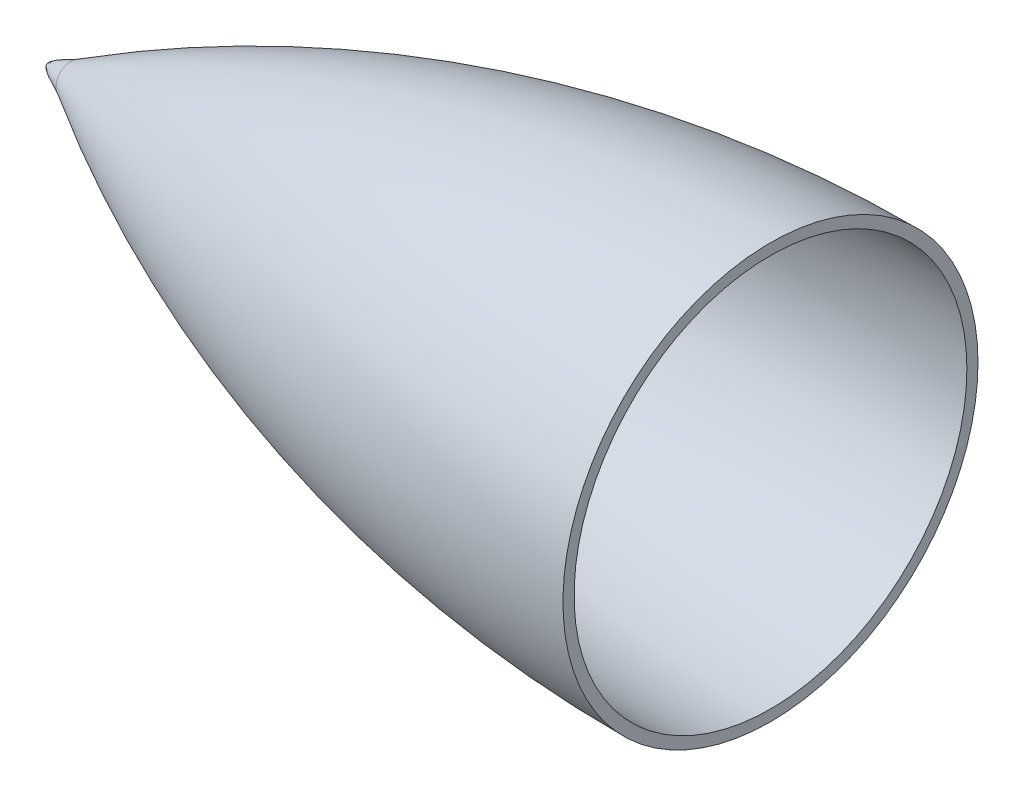
ISO-10303-21;
HEADER;
FILE_DESCRIPTION(('STEP AP214'),'2;1');
FILE_NAME('part.step','',(''),(''),'','','');
FILE_SCHEMA(('AUTOMOTIVE_DESIGN { 1 0 10303 214 1 1 1 1 }'));
ENDSEC;
DATA;
#1=APPLICATION_CONTEXT('core data for automotive mechanical design processes');
#2=APPLICATION_PROTOCOL_DEFINITION('international standard','automotive_design',2000,#1);
#3=PRODUCT_CONTEXT('',#1,'mechanical');
#4=PRODUCT('Part','Part','',(#3));
#5=PRODUCT_RELATED_PRODUCT_CATEGORY('part','',(#4));
#6=PRODUCT_DEFINITION_FORMATION('','',#4);
#7=PRODUCT_DEFINITION_CONTEXT('part definition',#1,'design');
#8=PRODUCT_DEFINITION('design','',#6,#7);
#9=PRODUCT_DEFINITION_SHAPE('','',#8);
#10=(LENGTH_UNIT() NAMED_UNIT(*) SI_UNIT(.MILLI.,.METRE.));
#11=(NAMED_UNIT(*) PLANE_ANGLE_UNIT() SI_UNIT($,.RADIAN.));
#12=(NAMED_UNIT(*) SI_UNIT($,.STERADIAN.) SOLID_ANGLE_UNIT());
#13=UNCERTAINTY_MEASURE_WITH_UNIT(LENGTH_MEASURE(1.E-05),#10,'distance_accuracy_value','');
#14=(GEOMETRIC_REPRESENTATION_CONTEXT(3) GLOBAL_UNCERTAINTY_ASSIGNED_CONTEXT((#13)) GLOBAL_UNIT_ASSIGNED_CONTEXT((#10,
#11,#12)) REPRESENTATION_CONTEXT('',''));
#15=CARTESIAN_POINT('',(0.,0.,0.));
#16=DIRECTION('',(0.,0.,1.));
#17=DIRECTION('',(1.,0.,0.));
#18=AXIS2_PLACEMENT_3D('',#15,#16,#17);
#19=CARTESIAN_POINT('',(0.,240.127906976744,0.));
#20=DIRECTION('',(1.,0.,0.));
#21=DIRECTION('',(0.,0.,-1.));
#22=AXIS2_PLACEMENT_3D('',#19,#20,#21);
#23=DEGENERATE_TOROIDAL_SURFACE('',#22,240.127906976744,283.127906976744,.F.);
#24=CARTESIAN_POINT('',(0.,240.127906976744,0.));
#25=DIRECTION('',(1.,0.,0.));
#26=DIRECTION('',(0.,0.,-1.));
#27=AXIS2_PLACEMENT_3D('',#24,#25,#26);
#28=CIRCLE('',#27,43.);
#29=CARTESIAN_POINT('',(0.,240.127906976744,-43.));
#30=VERTEX_POINT('',#29);
#31=EDGE_CURVE('E49',#30,#30,#28,.T.);
#32=ORIENTED_EDGE('',*,*,#31,.F.);
#33=EDGE_LOOP('',(#32));
#34=FACE_BOUND('',#33,.T.);
#35=CARTESIAN_POINT('',(-145.,240.127906976744,0.));
#36=DIRECTION('',(-1.,0.,0.));
#37=DIRECTION('',(0.,-1.,0.));
#38=AXIS2_PLACEMENT_3D('',#35,#36,#37);
#39=CIRCLE('',#38,3.05188599346112);
#40=CARTESIAN_POINT('',(-145.,237.076020983283,0.));
#41=VERTEX_POINT('',#40);
#42=EDGE_CURVE('E62',#41,#41,#39,.T.);
#43=ORIENTED_EDGE('',*,*,#42,.F.);
#44=EDGE_LOOP('',(#43));
#45=FACE_BOUND('',#44,.T.);
#46=ADVANCED_FACE('F41',(#34,#45),#23,.F.);
#47=CARTESIAN_POINT('',(0.,240.127906976744,0.));
#48=DIRECTION('',(1.,0.,0.));
#49=DIRECTION('',(0.,0.,-1.));
#50=AXIS2_PLACEMENT_3D('',#47,#48,#49);
#51=DEGENERATE_TOROIDAL_SURFACE('',#50,240.127906976744,280.827906976744,.F.);
#52=CARTESIAN_POINT('',(-75.,240.127906976744,0.));
#53=DIRECTION('',(1.,0.,0.));
#54=DIRECTION('',(0.,0.,-1.));
#55=AXIS2_PLACEMENT_3D('',#52,#53,#54);
#56=CIRCLE('',#55,30.499721577583);
#57=CARTESIAN_POINT('',(-75.,240.127906976744,-30.499721577583));
#58=VERTEX_POINT('',#57);
#59=EDGE_CURVE('E64',#58,#58,#56,.T.);
#60=ORIENTED_EDGE('',*,*,#59,.F.);
#61=EDGE_LOOP('',(#60));
#62=FACE_BOUND('',#61,.T.);
#63=CARTESIAN_POINT('',(0.,240.127906976744,0.));
#64=DIRECTION('',(1.,0.,0.));
#65=DIRECTION('',(0.,0.,-1.));
#66=AXIS2_PLACEMENT_3D('',#63,#64,#65);
#67=CIRCLE('',#66,40.7);
#68=CARTESIAN_POINT('',(0.,240.127906976744,-40.7));
#69=VERTEX_POINT('',#68);
#70=EDGE_CURVE('E11',#69,#69,#67,.T.);
#71=ORIENTED_EDGE('',*,*,#70,.T.);
#72=EDGE_LOOP('',(#71));
#73=FACE_BOUND('',#72,.T.);
#74=ADVANCED_FACE('F43',(#62,#73),#51,.T.);
#75=CARTESIAN_POINT('',(0.,0.,0.));
#76=DIRECTION('',(1.,0.,0.));
#77=DIRECTION('',(0.,0.,-1.));
#78=AXIS2_PLACEMENT_3D('',#75,#76,#77);
#79=PLANE('',#78);
#80=ORIENTED_EDGE('',*,*,#31,.T.);
#81=EDGE_LOOP('',(#80));
#82=FACE_BOUND('',#81,.T.);
#83=ORIENTED_EDGE('',*,*,#70,.F.);
#84=EDGE_LOOP('',(#83));
#85=FACE_BOUND('',#84,.T.);
#86=ADVANCED_FACE('F78',(#82,#85),#79,.T.);
#87=CARTESIAN_POINT('',(0.,240.127906976744,240.127906976744));
#88=DIRECTION('',(0.,-1.,0.));
#89=DIRECTION('',(0.,0.,-1.));
#90=AXIS2_PLACEMENT_3D('',#87,#88,#89);
#91=CIRCLE('',#90,278.127906976744);
#92=TRIMMED_CURVE('',#91,(PARAMETER_VALUE(-0.528881014787758)),
(PARAMETER_VALUE(0.528881014787758)),.T.,.PARAMETER.);
#93=CARTESIAN_POINT('',(0.,240.127906976744,0.));
#94=DIRECTION('',(1.,0.,0.));
#95=AXIS1_PLACEMENT('',#93,#94);
#96=SURFACE_OF_REVOLUTION('',#92,#95);
#97=CARTESIAN_POINT('',(-140.334318433634,240.127906976744,0.));
#98=VERTEX_POINT('',#97);
#99=VERTEX_LOOP('',#98);
#100=FACE_BOUND('',#99,.T.);
#101=CARTESIAN_POINT('',(-75.,240.127906976744,0.));
#102=DIRECTION('',(1.,0.,0.));
#103=DIRECTION('',(0.,0.,-1.));
#104=AXIS2_PLACEMENT_3D('',#101,#102,#103);
#105=CIRCLE('',#104,27.6969100945356);
#106=CARTESIAN_POINT('',(-75.,240.127906976744,-27.6969100945356));
#107=VERTEX_POINT('',#106);
#108=EDGE_CURVE('E67',#107,#107,#105,.T.);
#109=ORIENTED_EDGE('',*,*,#108,.T.);
#110=EDGE_LOOP('',(#109));
#111=FACE_BOUND('',#110,.T.);
#112=ADVANCED_FACE('F89',(#100,#111),#96,.F.);
#113=CARTESIAN_POINT('',(-75.,-3.71353582601418E-13,0.));
#114=DIRECTION('',(1.,0.,0.));
#115=DIRECTION('',(0.,0.,-1.));
#116=AXIS2_PLACEMENT_3D('',#113,#114,#115);
#117=PLANE('',#116);
#118=ORIENTED_EDGE('',*,*,#59,.T.);
#119=EDGE_LOOP('',(#118));
#120=FACE_BOUND('',#119,.T.);
#121=ORIENTED_EDGE('',*,*,#108,.F.);
#122=EDGE_LOOP('',(#121));
#123=FACE_BOUND('',#122,.T.);
#124=ADVANCED_FACE('F58',(#120,#123),#117,.T.);
#125=CARTESIAN_POINT('',(-145.,243.179792970205,0.));
#126=CARTESIAN_POINT('',(-147.476516828966,242.062259152708,0.));
#127=CARTESIAN_POINT('',(-149.571591747816,241.095083064726,0.));
#128=CARTESIAN_POINT('',(-150.,240.127906976744,0.));
#129=B_SPLINE_CURVE_WITH_KNOTS('',3,(#125,#126,#127,#128),.UNSPECIFIED.,.F.,.F.,(4,4),
(0.500000000000124,1.),.UNSPECIFIED.);
#130=CARTESIAN_POINT('',(-145.,240.127906976744,0.));
#131=DIRECTION('',(1.,0.,0.));
#132=AXIS1_PLACEMENT('',#130,#131);
#133=SURFACE_OF_REVOLUTION('',#129,#132);
#134=CARTESIAN_POINT('',(-150.,240.127906976744,0.));
#135=VERTEX_POINT('',#134);
#136=VERTEX_LOOP('',#135);
#137=FACE_BOUND('',#136,.T.);
#138=ORIENTED_EDGE('',*,*,#42,.T.);
#139=EDGE_LOOP('',(#138));
#140=FACE_BOUND('',#139,.T.);
#141=ADVANCED_FACE('F55',(#137,#140),#133,.F.);
#142=CLOSED_SHELL('',(#46,#74,#86,#112,#124,#141));
#143=MANIFOLD_SOLID_BREP('B2',#142);
#144=ADVANCED_BREP_SHAPE_REPRESENTATION('',(#18,#143),#14);
#145=SHAPE_DEFINITION_REPRESENTATION(#9,#144);
ENDSEC;
END-ISO-10303-21;
